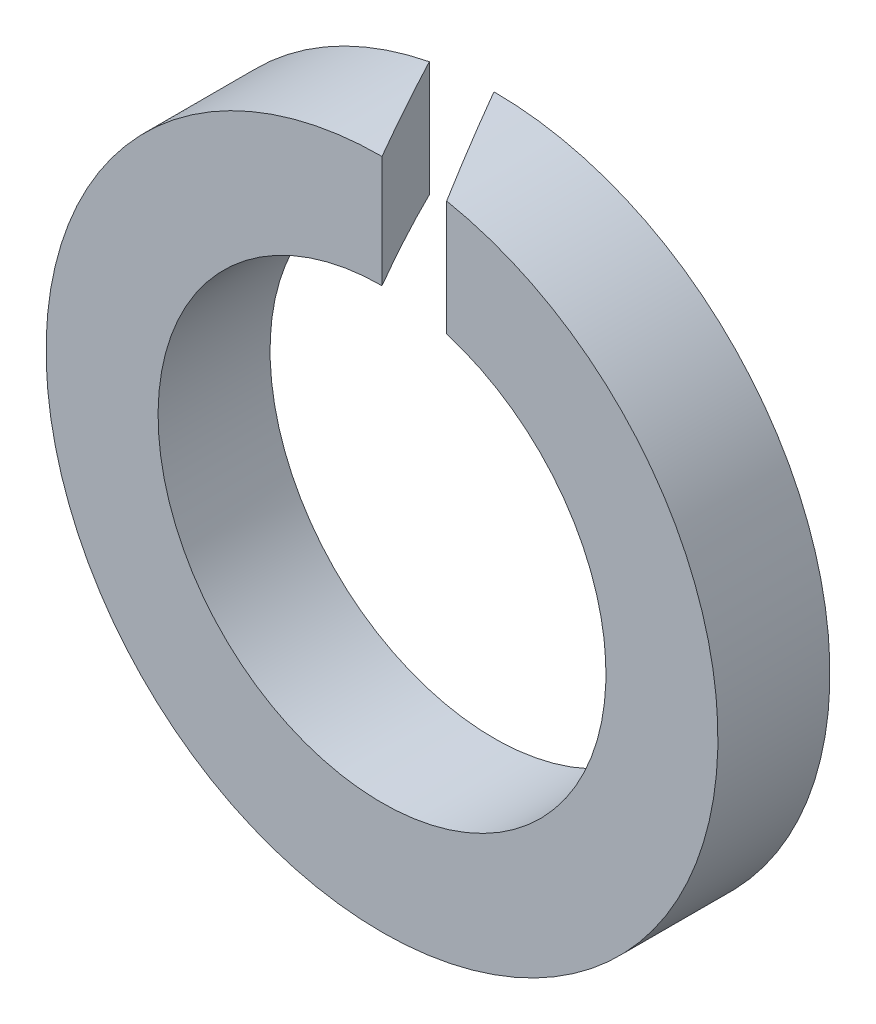
ISO-10303-21;
HEADER;
FILE_DESCRIPTION(('STEP AP214'),'2;1');
FILE_NAME('part.step','',(''),(''),'','','');
FILE_SCHEMA(('AUTOMOTIVE_DESIGN { 1 0 10303 214 1 1 1 1 }'));
ENDSEC;
DATA;
#1=APPLICATION_CONTEXT('core data for automotive mechanical design processes');
#2=APPLICATION_PROTOCOL_DEFINITION('international standard','automotive_design',2000,#1);
#3=PRODUCT_CONTEXT('',#1,'mechanical');
#4=PRODUCT('Part','Part','',(#3));
#5=PRODUCT_RELATED_PRODUCT_CATEGORY('part','',(#4));
#6=PRODUCT_DEFINITION_FORMATION('','',#4);
#7=PRODUCT_DEFINITION_CONTEXT('part definition',#1,'design');
#8=PRODUCT_DEFINITION('design','',#6,#7);
#9=PRODUCT_DEFINITION_SHAPE('','',#8);
#10=(LENGTH_UNIT() NAMED_UNIT(*) SI_UNIT(.MILLI.,.METRE.));
#11=(NAMED_UNIT(*) PLANE_ANGLE_UNIT() SI_UNIT($,.RADIAN.));
#12=(NAMED_UNIT(*) SI_UNIT($,.STERADIAN.) SOLID_ANGLE_UNIT());
#13=UNCERTAINTY_MEASURE_WITH_UNIT(LENGTH_MEASURE(1.E-05),#10,'distance_accuracy_value','');
#14=(GEOMETRIC_REPRESENTATION_CONTEXT(3) GLOBAL_UNCERTAINTY_ASSIGNED_CONTEXT((#13)) GLOBAL_UNIT_ASSIGNED_CONTEXT((#10,
#11,#12)) REPRESENTATION_CONTEXT('',''));
#15=CARTESIAN_POINT('',(0.,0.,0.));
#16=DIRECTION('',(0.,0.,1.));
#17=DIRECTION('',(1.,0.,0.));
#18=AXIS2_PLACEMENT_3D('',#15,#16,#17);
#19=CARTESIAN_POINT('',(0.,0.,-1.1));
#20=DIRECTION('',(0.,0.,1.));
#21=DIRECTION('',(1.,0.,0.));
#22=AXIS2_PLACEMENT_3D('',#19,#20,#21);
#23=PLANE('',#22);
#24=DIRECTION('',(0.,1.,0.));
#25=VECTOR('',#24,1.);
#26=CARTESIAN_POINT('',(-0.635085296108588,3.3,-1.1));
#27=LINE('',#26,#25);
#28=CARTESIAN_POINT('',(-0.635085296108588,2.10633963706394,-1.1));
#29=VERTEX_POINT('',#28);
#30=CARTESIAN_POINT('',(-0.635085296108588,3.23831231765354,-1.1));
#31=VERTEX_POINT('',#30);
#32=EDGE_CURVE('E63',#29,#31,#27,.T.);
#33=ORIENTED_EDGE('',*,*,#32,.F.);
#34=CARTESIAN_POINT('',(0.,0.,-1.1));
#35=DIRECTION('',(0.,0.,1.));
#36=DIRECTION('',(1.,0.,0.));
#37=AXIS2_PLACEMENT_3D('',#34,#35,#36);
#38=CIRCLE('',#37,2.2);
#39=CARTESIAN_POINT('',(0.,2.2,-1.1));
#40=VERTEX_POINT('',#39);
#41=EDGE_CURVE('E58',#29,#40,#38,.T.);
#42=ORIENTED_EDGE('',*,*,#41,.T.);
#43=DIRECTION('',(0.,1.,0.));
#44=VECTOR('',#43,1.);
#45=CARTESIAN_POINT('',(0.,3.3,-1.1));
#46=LINE('',#45,#44);
#47=CARTESIAN_POINT('',(0.,3.3,-1.1));
#48=VERTEX_POINT('',#47);
#49=EDGE_CURVE('E60',#48,#40,#46,.F.);
#50=ORIENTED_EDGE('',*,*,#49,.F.);
#51=CARTESIAN_POINT('',(0.,0.,-1.1));
#52=DIRECTION('',(0.,0.,1.));
#53=DIRECTION('',(1.,0.,0.));
#54=AXIS2_PLACEMENT_3D('',#51,#52,#53);
#55=CIRCLE('',#54,3.3);
#56=EDGE_CURVE('E72',#31,#48,#55,.T.);
#57=ORIENTED_EDGE('',*,*,#56,.F.);
#58=EDGE_LOOP('',(#33,#42,#50,#57));
#59=FACE_BOUND('',#58,.T.);
#60=ADVANCED_FACE('F18',(#59),#23,.F.);
#61=CARTESIAN_POINT('',(0.,3.3,0.));
#62=DIRECTION('',(0.866025403784439,0.,-0.5));
#63=DIRECTION('',(-0.5,0.,-0.866025403784439));
#64=AXIS2_PLACEMENT_3D('',#61,#62,#63);
#65=PLANE('',#64);
#66=ORIENTED_EDGE('',*,*,#32,.T.);
#67=CARTESIAN_POINT('',(0.,0.,0.));
#68=DIRECTION('',(0.866025403784439,0.,-0.5));
#69=DIRECTION('',(0.5,0.,0.866025403784439));
#70=AXIS2_PLACEMENT_3D('',#67,#68,#69);
#71=ELLIPSE('',#70,6.6,3.3);
#72=CARTESIAN_POINT('',(0.,3.3,0.));
#73=VERTEX_POINT('',#72);
#74=EDGE_CURVE('E79',#73,#31,#71,.F.);
#75=ORIENTED_EDGE('',*,*,#74,.F.);
#76=DIRECTION('',(0.,1.,0.));
#77=VECTOR('',#76,1.);
#78=CARTESIAN_POINT('',(0.,0.,0.));
#79=LINE('',#78,#77);
#80=CARTESIAN_POINT('',(0.,2.2,0.));
#81=VERTEX_POINT('',#80);
#82=EDGE_CURVE('E87',#81,#73,#79,.T.);
#83=ORIENTED_EDGE('',*,*,#82,.F.);
#84=CARTESIAN_POINT('',(0.,0.,0.));
#85=DIRECTION('',(0.866025403784439,0.,-0.5));
#86=DIRECTION('',(0.5,0.,0.866025403784439));
#87=AXIS2_PLACEMENT_3D('',#84,#85,#86);
#88=ELLIPSE('',#87,4.4,2.2);
#89=EDGE_CURVE('E21',#81,#29,#88,.F.);
#90=ORIENTED_EDGE('',*,*,#89,.T.);
#91=EDGE_LOOP('',(#66,#75,#83,#90));
#92=FACE_BOUND('',#91,.T.);
#93=ADVANCED_FACE('F91',(#92),#65,.T.);
#94=CARTESIAN_POINT('',(0.,0.,-1.1));
#95=DIRECTION('',(0.,0.,1.));
#96=DIRECTION('',(1.,0.,0.));
#97=AXIS2_PLACEMENT_3D('',#94,#95,#96);
#98=CYLINDRICAL_SURFACE('',#97,3.3);
#99=CARTESIAN_POINT('',(0.,0.,-1.1));
#100=DIRECTION('',(-0.866025403784439,0.,0.5));
#101=DIRECTION('',(0.5,0.,0.866025403784439));
#102=AXIS2_PLACEMENT_3D('',#99,#100,#101);
#103=ELLIPSE('',#102,6.6,3.3);
#104=CARTESIAN_POINT('',(0.635085296108588,3.23831231765354,0.));
#105=VERTEX_POINT('',#104);
#106=EDGE_CURVE('E71',#105,#48,#103,.T.);
#107=ORIENTED_EDGE('',*,*,#106,.F.);
#108=CARTESIAN_POINT('',(0.,0.,0.));
#109=DIRECTION('',(0.,0.,1.));
#110=DIRECTION('',(1.,0.,0.));
#111=AXIS2_PLACEMENT_3D('',#108,#109,#110);
#112=CIRCLE('',#111,3.3);
#113=EDGE_CURVE('E27',#73,#105,#112,.T.);
#114=ORIENTED_EDGE('',*,*,#113,.F.);
#115=ORIENTED_EDGE('',*,*,#74,.T.);
#116=ORIENTED_EDGE('',*,*,#56,.T.);
#117=EDGE_LOOP('',(#107,#114,#115,#116));
#118=FACE_BOUND('',#117,.T.);
#119=ADVANCED_FACE('F92',(#118),#98,.T.);
#120=CARTESIAN_POINT('',(0.,3.3,-1.1));
#121=DIRECTION('',(-0.866025403784439,0.,0.5));
#122=DIRECTION('',(0.5,0.,0.866025403784439));
#123=AXIS2_PLACEMENT_3D('',#120,#121,#122);
#124=PLANE('',#123);
#125=DIRECTION('',(0.,1.,0.));
#126=VECTOR('',#125,1.);
#127=CARTESIAN_POINT('',(0.635085296108588,0.,0.));
#128=LINE('',#127,#126);
#129=CARTESIAN_POINT('',(0.635085296108588,2.10633963706394,0.));
#130=VERTEX_POINT('',#129);
#131=EDGE_CURVE('E11',#105,#130,#128,.F.);
#132=ORIENTED_EDGE('',*,*,#131,.F.);
#133=ORIENTED_EDGE('',*,*,#106,.T.);
#134=ORIENTED_EDGE('',*,*,#49,.T.);
#135=CARTESIAN_POINT('',(0.,0.,-1.1));
#136=DIRECTION('',(-0.866025403784439,0.,0.5));
#137=DIRECTION('',(0.5,0.,0.866025403784439));
#138=AXIS2_PLACEMENT_3D('',#135,#136,#137);
#139=ELLIPSE('',#138,4.4,2.2);
#140=EDGE_CURVE('E64',#40,#130,#139,.F.);
#141=ORIENTED_EDGE('',*,*,#140,.T.);
#142=EDGE_LOOP('',(#132,#133,#134,#141));
#143=FACE_BOUND('',#142,.T.);
#144=ADVANCED_FACE('F69',(#143),#124,.T.);
#145=CARTESIAN_POINT('',(0.,0.,-1.1));
#146=DIRECTION('',(0.,0.,1.));
#147=DIRECTION('',(1.,0.,0.));
#148=AXIS2_PLACEMENT_3D('',#145,#146,#147);
#149=CYLINDRICAL_SURFACE('',#148,2.2);
#150=ORIENTED_EDGE('',*,*,#41,.F.);
#151=ORIENTED_EDGE('',*,*,#89,.F.);
#152=CARTESIAN_POINT('',(0.,0.,0.));
#153=DIRECTION('',(0.,0.,1.));
#154=DIRECTION('',(1.,0.,0.));
#155=AXIS2_PLACEMENT_3D('',#152,#153,#154);
#156=CIRCLE('',#155,2.2);
#157=EDGE_CURVE('E36',#130,#81,#156,.F.);
#158=ORIENTED_EDGE('',*,*,#157,.F.);
#159=ORIENTED_EDGE('',*,*,#140,.F.);
#160=EDGE_LOOP('',(#150,#151,#158,#159));
#161=FACE_BOUND('',#160,.T.);
#162=ADVANCED_FACE('F74',(#161),#149,.F.);
#163=CARTESIAN_POINT('',(0.,0.,0.));
#164=DIRECTION('',(0.,0.,1.));
#165=DIRECTION('',(1.,0.,0.));
#166=AXIS2_PLACEMENT_3D('',#163,#164,#165);
#167=PLANE('',#166);
#168=ORIENTED_EDGE('',*,*,#131,.T.);
#169=ORIENTED_EDGE('',*,*,#157,.T.);
#170=ORIENTED_EDGE('',*,*,#82,.T.);
#171=ORIENTED_EDGE('',*,*,#113,.T.);
#172=EDGE_LOOP('',(#168,#169,#170,#171));
#173=FACE_BOUND('',#172,.T.);
#174=ADVANCED_FACE('F90',(#173),#167,.T.);
#175=CLOSED_SHELL('',(#60,#93,#119,#144,#162,#174));
#176=MANIFOLD_SOLID_BREP('B1',#175);
#177=ADVANCED_BREP_SHAPE_REPRESENTATION('',(#18,#176),#14);
#178=SHAPE_DEFINITION_REPRESENTATION(#9,#177);
ENDSEC;
END-ISO-10303-21;
